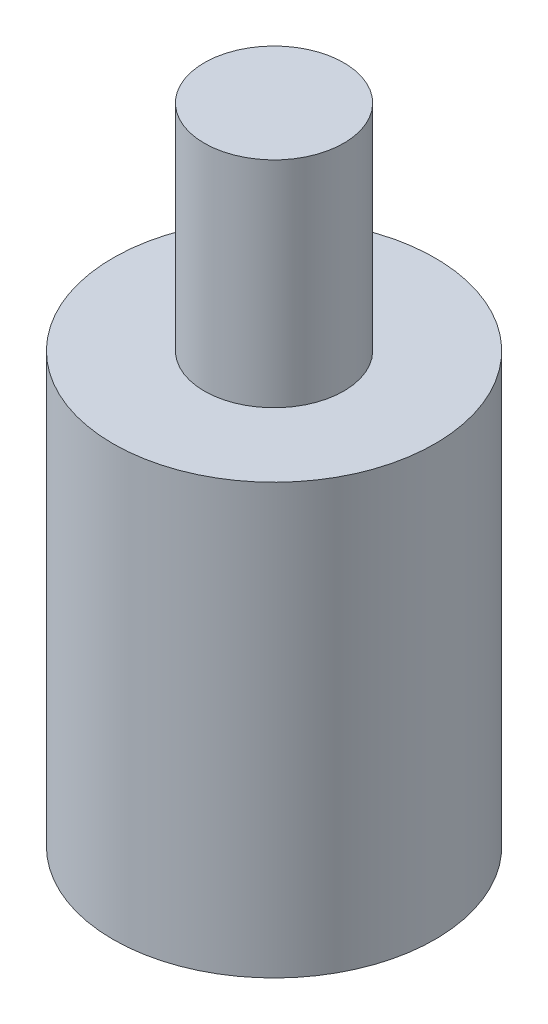
ISO-10303-21;
HEADER;
FILE_DESCRIPTION(('STEP AP214'),'2;1');
FILE_NAME('part.step','',(''),(''),'','','');
FILE_SCHEMA(('AUTOMOTIVE_DESIGN { 1 0 10303 214 1 1 1 1 }'));
ENDSEC;
DATA;
#1=APPLICATION_CONTEXT('core data for automotive mechanical design processes');
#2=APPLICATION_PROTOCOL_DEFINITION('international standard','automotive_design',2000,#1);
#3=PRODUCT_CONTEXT('',#1,'mechanical');
#4=PRODUCT('Part','Part','',(#3));
#5=PRODUCT_RELATED_PRODUCT_CATEGORY('part','',(#4));
#6=PRODUCT_DEFINITION_FORMATION('','',#4);
#7=PRODUCT_DEFINITION_CONTEXT('part definition',#1,'design');
#8=PRODUCT_DEFINITION('design','',#6,#7);
#9=PRODUCT_DEFINITION_SHAPE('','',#8);
#10=(LENGTH_UNIT() NAMED_UNIT(*) SI_UNIT(.MILLI.,.METRE.));
#11=(NAMED_UNIT(*) PLANE_ANGLE_UNIT() SI_UNIT($,.RADIAN.));
#12=(NAMED_UNIT(*) SI_UNIT($,.STERADIAN.) SOLID_ANGLE_UNIT());
#13=UNCERTAINTY_MEASURE_WITH_UNIT(LENGTH_MEASURE(1.E-05),#10,'distance_accuracy_value','');
#14=(GEOMETRIC_REPRESENTATION_CONTEXT(3) GLOBAL_UNCERTAINTY_ASSIGNED_CONTEXT((#13)) GLOBAL_UNIT_ASSIGNED_CONTEXT((#10,
#11,#12)) REPRESENTATION_CONTEXT('',''));
#15=CARTESIAN_POINT('',(0.,0.,0.));
#16=DIRECTION('',(0.,0.,1.));
#17=DIRECTION('',(1.,0.,0.));
#18=AXIS2_PLACEMENT_3D('',#15,#16,#17);
#19=CARTESIAN_POINT('',(0.,8.,0.));
#20=DIRECTION('',(0.,-1.,0.));
#21=DIRECTION('',(0.,0.,-1.));
#22=AXIS2_PLACEMENT_3D('',#19,#20,#21);
#23=CYLINDRICAL_SURFACE('',#22,3.);
#24=CARTESIAN_POINT('',(0.,8.,0.));
#25=DIRECTION('',(0.,1.,0.));
#26=DIRECTION('',(0.,0.,1.));
#27=AXIS2_PLACEMENT_3D('',#24,#25,#26);
#28=CIRCLE('',#27,3.);
#29=CARTESIAN_POINT('',(0.,8.,3.));
#30=VERTEX_POINT('',#29);
#31=EDGE_CURVE('E45',#30,#30,#28,.T.);
#32=ORIENTED_EDGE('',*,*,#31,.F.);
#33=EDGE_LOOP('',(#32));
#34=FACE_BOUND('',#33,.T.);
#35=CARTESIAN_POINT('',(0.,0.,0.));
#36=DIRECTION('',(0.,1.,0.));
#37=DIRECTION('',(0.,0.,1.));
#38=AXIS2_PLACEMENT_3D('',#35,#36,#37);
#39=CIRCLE('',#38,3.);
#40=CARTESIAN_POINT('',(0.,0.,3.));
#41=VERTEX_POINT('',#40);
#42=EDGE_CURVE('E40',#41,#41,#39,.T.);
#43=ORIENTED_EDGE('',*,*,#42,.T.);
#44=EDGE_LOOP('',(#43));
#45=FACE_BOUND('',#44,.T.);
#46=ADVANCED_FACE('F37',(#34,#45),#23,.T.);
#47=CARTESIAN_POINT('',(0.,8.,0.));
#48=DIRECTION('',(0.,1.,0.));
#49=DIRECTION('',(0.,0.,1.));
#50=AXIS2_PLACEMENT_3D('',#47,#48,#49);
#51=PLANE('',#50);
#52=CARTESIAN_POINT('',(0.,8.,0.));
#53=DIRECTION('',(0.,1.,0.));
#54=DIRECTION('',(0.,0.,1.));
#55=AXIS2_PLACEMENT_3D('',#52,#53,#54);
#56=CIRCLE('',#55,1.3);
#57=CARTESIAN_POINT('',(0.,8.,1.3));
#58=VERTEX_POINT('',#57);
#59=EDGE_CURVE('E10',#58,#58,#56,.T.);
#60=ORIENTED_EDGE('',*,*,#59,.F.);
#61=EDGE_LOOP('',(#60));
#62=FACE_BOUND('',#61,.T.);
#63=ORIENTED_EDGE('',*,*,#31,.T.);
#64=EDGE_LOOP('',(#63));
#65=FACE_BOUND('',#64,.T.);
#66=ADVANCED_FACE('F78',(#62,#65),#51,.T.);
#67=CARTESIAN_POINT('',(0.,0.,0.));
#68=DIRECTION('',(0.,1.,0.));
#69=DIRECTION('',(0.,0.,1.));
#70=AXIS2_PLACEMENT_3D('',#67,#68,#69);
#71=PLANE('',#70);
#72=CARTESIAN_POINT('',(0.,0.,0.));
#73=DIRECTION('',(0.,-1.,0.));
#74=DIRECTION('',(0.,0.,-1.));
#75=AXIS2_PLACEMENT_3D('',#72,#73,#74);
#76=CIRCLE('',#75,1.75);
#77=CARTESIAN_POINT('',(0.,0.,-1.75));
#78=VERTEX_POINT('',#77);
#79=EDGE_CURVE('E57',#78,#78,#76,.T.);
#80=ORIENTED_EDGE('',*,*,#79,.F.);
#81=EDGE_LOOP('',(#80));
#82=FACE_BOUND('',#81,.T.);
#83=ORIENTED_EDGE('',*,*,#42,.F.);
#84=EDGE_LOOP('',(#83));
#85=FACE_BOUND('',#84,.T.);
#86=ADVANCED_FACE('F74',(#82,#85),#71,.F.);
#87=CARTESIAN_POINT('',(0.,12.,0.));
#88=DIRECTION('',(0.,-1.,0.));
#89=DIRECTION('',(0.,0.,-1.));
#90=AXIS2_PLACEMENT_3D('',#87,#88,#89);
#91=CYLINDRICAL_SURFACE('',#90,1.3);
#92=CARTESIAN_POINT('',(0.,12.,0.));
#93=DIRECTION('',(0.,1.,0.));
#94=DIRECTION('',(0.,0.,1.));
#95=AXIS2_PLACEMENT_3D('',#92,#93,#94);
#96=CIRCLE('',#95,1.3);
#97=CARTESIAN_POINT('',(0.,12.,1.3));
#98=VERTEX_POINT('',#97);
#99=EDGE_CURVE('E52',#98,#98,#96,.T.);
#100=ORIENTED_EDGE('',*,*,#99,.F.);
#101=EDGE_LOOP('',(#100));
#102=FACE_BOUND('',#101,.T.);
#103=ORIENTED_EDGE('',*,*,#59,.T.);
#104=EDGE_LOOP('',(#103));
#105=FACE_BOUND('',#104,.T.);
#106=ADVANCED_FACE('F77',(#102,#105),#91,.T.);
#107=CARTESIAN_POINT('',(0.,12.,0.));
#108=DIRECTION('',(0.,1.,0.));
#109=DIRECTION('',(0.,0.,1.));
#110=AXIS2_PLACEMENT_3D('',#107,#108,#109);
#111=PLANE('',#110);
#112=ORIENTED_EDGE('',*,*,#99,.T.);
#113=EDGE_LOOP('',(#112));
#114=FACE_BOUND('',#113,.T.);
#115=ADVANCED_FACE('F70',(#114),#111,.T.);
#116=CARTESIAN_POINT('',(0.,6.,0.));
#117=DIRECTION('',(0.,-1.,0.));
#118=DIRECTION('',(0.,0.,-1.));
#119=AXIS2_PLACEMENT_3D('',#116,#117,#118);
#120=CYLINDRICAL_SURFACE('',#119,1.75);
#121=CARTESIAN_POINT('',(0.,6.,0.));
#122=DIRECTION('',(0.,-1.,0.));
#123=DIRECTION('',(0.,0.,-1.));
#124=AXIS2_PLACEMENT_3D('',#121,#122,#123);
#125=CIRCLE('',#124,1.75);
#126=CARTESIAN_POINT('',(0.,6.,-1.75));
#127=VERTEX_POINT('',#126);
#128=EDGE_CURVE('E56',#127,#127,#125,.T.);
#129=ORIENTED_EDGE('',*,*,#128,.F.);
#130=EDGE_LOOP('',(#129));
#131=FACE_BOUND('',#130,.T.);
#132=ORIENTED_EDGE('',*,*,#79,.T.);
#133=EDGE_LOOP('',(#132));
#134=FACE_BOUND('',#133,.T.);
#135=ADVANCED_FACE('F67',(#131,#134),#120,.F.);
#136=CARTESIAN_POINT('',(0.,6.,0.));
#137=DIRECTION('',(0.,-1.,0.));
#138=DIRECTION('',(0.,0.,-1.));
#139=AXIS2_PLACEMENT_3D('',#136,#137,#138);
#140=PLANE('',#139);
#141=ORIENTED_EDGE('',*,*,#128,.T.);
#142=EDGE_LOOP('',(#141));
#143=FACE_BOUND('',#142,.T.);
#144=ADVANCED_FACE('F65',(#143),#140,.T.);
#145=CLOSED_SHELL('',(#46,#66,#86,#106,#115,#135,#144));
#146=MANIFOLD_SOLID_BREP('B2',#145);
#147=ADVANCED_BREP_SHAPE_REPRESENTATION('',(#18,#146),#14);
#148=SHAPE_DEFINITION_REPRESENTATION(#9,#147);
ENDSEC;
END-ISO-10303-21;
